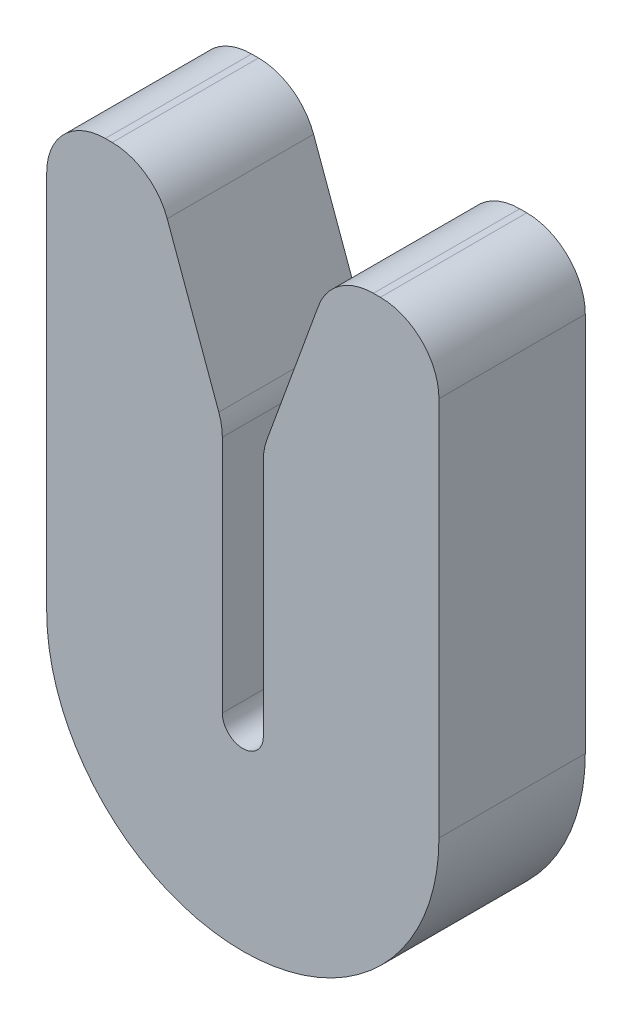
ISO-10303-21;
HEADER;
FILE_DESCRIPTION(('STEP AP214'),'2;1');
FILE_NAME('part.step','',(''),(''),'','','');
FILE_SCHEMA(('AUTOMOTIVE_DESIGN { 1 0 10303 214 1 1 1 1 }'));
ENDSEC;
DATA;
#1=APPLICATION_CONTEXT('core data for automotive mechanical design processes');
#2=APPLICATION_PROTOCOL_DEFINITION('international standard','automotive_design',2000,#1);
#3=PRODUCT_CONTEXT('',#1,'mechanical');
#4=PRODUCT('Part','Part','',(#3));
#5=PRODUCT_RELATED_PRODUCT_CATEGORY('part','',(#4));
#6=PRODUCT_DEFINITION_FORMATION('','',#4);
#7=PRODUCT_DEFINITION_CONTEXT('part definition',#1,'design');
#8=PRODUCT_DEFINITION('design','',#6,#7);
#9=PRODUCT_DEFINITION_SHAPE('','',#8);
#10=(LENGTH_UNIT() NAMED_UNIT(*) SI_UNIT(.MILLI.,.METRE.));
#11=(NAMED_UNIT(*) PLANE_ANGLE_UNIT() SI_UNIT($,.RADIAN.));
#12=(NAMED_UNIT(*) SI_UNIT($,.STERADIAN.) SOLID_ANGLE_UNIT());
#13=UNCERTAINTY_MEASURE_WITH_UNIT(LENGTH_MEASURE(1.E-05),#10,'distance_accuracy_value','');
#14=(GEOMETRIC_REPRESENTATION_CONTEXT(3) GLOBAL_UNCERTAINTY_ASSIGNED_CONTEXT((#13)) GLOBAL_UNIT_ASSIGNED_CONTEXT((#10,
#11,#12)) REPRESENTATION_CONTEXT('',''));
#15=CARTESIAN_POINT('',(0.,0.,0.));
#16=DIRECTION('',(0.,0.,1.));
#17=DIRECTION('',(1.,0.,0.));
#18=AXIS2_PLACEMENT_3D('',#15,#16,#17);
#19=CARTESIAN_POINT('',(0.7,8.51100736403509,5.));
#20=DIRECTION('',(0.939692620785908,-0.34202014332567,0.));
#21=DIRECTION('',(0.34202014332567,0.939692620785908,0.));
#22=AXIS2_PLACEMENT_3D('',#19,#20,#21);
#23=PLANE('',#22);
#24=DIRECTION('',(-0.34202014332567,-0.939692620785908,0.));
#25=VECTOR('',#24,1.);
#26=CARTESIAN_POINT('',(0.7,8.51100736403509,5.));
#27=LINE('',#26,#25);
#28=CARTESIAN_POINT('',(2.58283000471142,13.6840402866513,5.));
#29=VERTEX_POINT('',#28);
#30=CARTESIAN_POINT('',(0.820614758428184,8.8423936892695,5.));
#31=VERTEX_POINT('',#30);
#32=EDGE_CURVE('E165',#29,#31,#27,.T.);
#33=ORIENTED_EDGE('',*,*,#32,.F.);
#34=DIRECTION('',(0.,0.,-1.));
#35=VECTOR('',#34,1.);
#36=CARTESIAN_POINT('',(2.58283000471142,13.6840402866513,5.));
#37=LINE('',#36,#35);
#38=CARTESIAN_POINT('',(2.58283000471142,13.6840402866513,0.));
#39=VERTEX_POINT('',#38);
#40=EDGE_CURVE('E351',#29,#39,#37,.T.);
#41=ORIENTED_EDGE('',*,*,#40,.T.);
#42=DIRECTION('',(-0.34202014332567,-0.939692620785908,0.));
#43=VECTOR('',#42,1.);
#44=CARTESIAN_POINT('',(0.7,8.51100736403509,0.));
#45=LINE('',#44,#43);
#46=CARTESIAN_POINT('',(0.820614758428184,8.8423936892695,0.));
#47=VERTEX_POINT('',#46);
#48=EDGE_CURVE('E291',#39,#47,#45,.T.);
#49=ORIENTED_EDGE('',*,*,#48,.T.);
#50=DIRECTION('',(0.,0.,-1.));
#51=VECTOR('',#50,1.);
#52=CARTESIAN_POINT('',(0.820614758428184,8.8423936892695,5.));
#53=LINE('',#52,#51);
#54=EDGE_CURVE('E350',#47,#31,#53,.F.);
#55=ORIENTED_EDGE('',*,*,#54,.T.);
#56=EDGE_LOOP('',(#33,#41,#49,#55));
#57=FACE_BOUND('',#56,.T.);
#58=ADVANCED_FACE('F38',(#57),#23,.F.);
#59=CARTESIAN_POINT('',(0.7,0.,5.));
#60=DIRECTION('',(1.,0.,0.));
#61=DIRECTION('',(0.,0.,-1.));
#62=AXIS2_PLACEMENT_3D('',#59,#60,#61);
#63=PLANE('',#62);
#64=DIRECTION('',(0.,-1.,0.));
#65=VECTOR('',#64,1.);
#66=CARTESIAN_POINT('',(0.7,0.,5.));
#67=LINE('',#66,#65);
#68=CARTESIAN_POINT('',(0.7,8.15835340261816,5.));
#69=VERTEX_POINT('',#68);
#70=CARTESIAN_POINT('',(0.7,0.,5.));
#71=VERTEX_POINT('',#70);
#72=EDGE_CURVE('E150',#69,#71,#67,.T.);
#73=ORIENTED_EDGE('',*,*,#72,.F.);
#74=DIRECTION('',(0.,0.,-1.));
#75=VECTOR('',#74,1.);
#76=CARTESIAN_POINT('',(0.7,8.15835340261816,5.));
#77=LINE('',#76,#75);
#78=CARTESIAN_POINT('',(0.7,8.15835340261816,0.));
#79=VERTEX_POINT('',#78);
#80=EDGE_CURVE('E46',#69,#79,#77,.T.);
#81=ORIENTED_EDGE('',*,*,#80,.T.);
#82=DIRECTION('',(0.,-1.,0.));
#83=VECTOR('',#82,1.);
#84=CARTESIAN_POINT('',(0.7,0.,0.));
#85=LINE('',#84,#83);
#86=CARTESIAN_POINT('',(0.7,0.,0.));
#87=VERTEX_POINT('',#86);
#88=EDGE_CURVE('E171',#79,#87,#85,.T.);
#89=ORIENTED_EDGE('',*,*,#88,.T.);
#90=DIRECTION('',(0.,0.,-1.));
#91=VECTOR('',#90,1.);
#92=CARTESIAN_POINT('',(0.7,0.,5.));
#93=LINE('',#92,#91);
#94=EDGE_CURVE('E168',#71,#87,#93,.T.);
#95=ORIENTED_EDGE('',*,*,#94,.F.);
#96=EDGE_LOOP('',(#73,#81,#89,#95));
#97=FACE_BOUND('',#96,.T.);
#98=ADVANCED_FACE('F169',(#97),#63,.F.);
#99=CARTESIAN_POINT('',(0.,0.,5.));
#100=DIRECTION('',(0.,0.,-1.));
#101=DIRECTION('',(-1.,0.,0.));
#102=AXIS2_PLACEMENT_3D('',#99,#100,#101);
#103=CYLINDRICAL_SURFACE('',#102,0.7);
#104=CARTESIAN_POINT('',(0.,0.,0.));
#105=DIRECTION('',(0.,0.,-1.));
#106=DIRECTION('',(1.,0.,0.));
#107=AXIS2_PLACEMENT_3D('',#104,#105,#106);
#108=CIRCLE('',#107,0.7);
#109=CARTESIAN_POINT('',(-0.7,0.,0.));
#110=VERTEX_POINT('',#109);
#111=EDGE_CURVE('E295',#87,#110,#108,.T.);
#112=ORIENTED_EDGE('',*,*,#111,.T.);
#113=DIRECTION('',(0.,0.,-1.));
#114=VECTOR('',#113,1.);
#115=CARTESIAN_POINT('',(-0.7,0.,5.));
#116=LINE('',#115,#114);
#117=CARTESIAN_POINT('',(-0.7,0.,5.));
#118=VERTEX_POINT('',#117);
#119=EDGE_CURVE('E175',#118,#110,#116,.T.);
#120=ORIENTED_EDGE('',*,*,#119,.F.);
#121=CARTESIAN_POINT('',(0.,0.,5.));
#122=DIRECTION('',(0.,0.,-1.));
#123=DIRECTION('',(1.,0.,0.));
#124=AXIS2_PLACEMENT_3D('',#121,#122,#123);
#125=CIRCLE('',#124,0.7);
#126=EDGE_CURVE('E156',#71,#118,#125,.T.);
#127=ORIENTED_EDGE('',*,*,#126,.F.);
#128=ORIENTED_EDGE('',*,*,#94,.T.);
#129=EDGE_LOOP('',(#112,#120,#127,#128));
#130=FACE_BOUND('',#129,.T.);
#131=ADVANCED_FACE('F177',(#130),#103,.F.);
#132=CARTESIAN_POINT('',(-0.7,0.,5.));
#133=DIRECTION('',(-1.,0.,0.));
#134=DIRECTION('',(0.,0.,1.));
#135=AXIS2_PLACEMENT_3D('',#132,#133,#134);
#136=PLANE('',#135);
#137=DIRECTION('',(0.,1.,0.));
#138=VECTOR('',#137,1.);
#139=CARTESIAN_POINT('',(-0.7,0.,0.));
#140=LINE('',#139,#138);
#141=CARTESIAN_POINT('',(-0.7,8.15835340261816,0.));
#142=VERTEX_POINT('',#141);
#143=EDGE_CURVE('E297',#110,#142,#140,.T.);
#144=ORIENTED_EDGE('',*,*,#143,.T.);
#145=DIRECTION('',(0.,0.,-1.));
#146=VECTOR('',#145,1.);
#147=CARTESIAN_POINT('',(-0.7,8.15835340261816,5.));
#148=LINE('',#147,#146);
#149=CARTESIAN_POINT('',(-0.7,8.15835340261816,5.));
#150=VERTEX_POINT('',#149);
#151=EDGE_CURVE('E12',#142,#150,#148,.F.);
#152=ORIENTED_EDGE('',*,*,#151,.T.);
#153=DIRECTION('',(0.,1.,0.));
#154=VECTOR('',#153,1.);
#155=CARTESIAN_POINT('',(-0.7,0.,5.));
#156=LINE('',#155,#154);
#157=EDGE_CURVE('E181',#118,#150,#156,.T.);
#158=ORIENTED_EDGE('',*,*,#157,.F.);
#159=ORIENTED_EDGE('',*,*,#119,.T.);
#160=EDGE_LOOP('',(#144,#152,#158,#159));
#161=FACE_BOUND('',#160,.T.);
#162=ADVANCED_FACE('F391',(#161),#136,.F.);
#163=CARTESIAN_POINT('',(-3.06180016986381,15.,5.));
#164=DIRECTION('',(-0.939692620785908,-0.34202014332567,0.));
#165=DIRECTION('',(0.34202014332567,-0.939692620785908,0.));
#166=AXIS2_PLACEMENT_3D('',#163,#164,#165);
#167=PLANE('',#166);
#168=DIRECTION('',(-0.34202014332567,0.939692620785908,0.));
#169=VECTOR('',#168,1.);
#170=CARTESIAN_POINT('',(-3.06180016986381,15.,0.));
#171=LINE('',#170,#169);
#172=CARTESIAN_POINT('',(-0.820614758428184,8.8423936892695,0.));
#173=VERTEX_POINT('',#172);
#174=CARTESIAN_POINT('',(-2.58283000471142,13.6840402866513,0.));
#175=VERTEX_POINT('',#174);
#176=EDGE_CURVE('E300',#173,#175,#171,.T.);
#177=ORIENTED_EDGE('',*,*,#176,.T.);
#178=DIRECTION('',(0.,0.,-1.));
#179=VECTOR('',#178,1.);
#180=CARTESIAN_POINT('',(-2.58283000471142,13.6840402866513,5.));
#181=LINE('',#180,#179);
#182=CARTESIAN_POINT('',(-2.58283000471142,13.6840402866513,5.));
#183=VERTEX_POINT('',#182);
#184=EDGE_CURVE('E356',#175,#183,#181,.F.);
#185=ORIENTED_EDGE('',*,*,#184,.T.);
#186=DIRECTION('',(-0.34202014332567,0.939692620785908,0.));
#187=VECTOR('',#186,1.);
#188=CARTESIAN_POINT('',(-3.06180016986381,15.,5.));
#189=LINE('',#188,#187);
#190=CARTESIAN_POINT('',(-0.820614758428184,8.8423936892695,5.));
#191=VERTEX_POINT('',#190);
#192=EDGE_CURVE('E184',#191,#183,#189,.T.);
#193=ORIENTED_EDGE('',*,*,#192,.F.);
#194=DIRECTION('',(0.,0.,-1.));
#195=VECTOR('',#194,1.);
#196=CARTESIAN_POINT('',(-0.820614758428184,8.8423936892695,5.));
#197=LINE('',#196,#195);
#198=EDGE_CURVE('E358',#191,#173,#197,.T.);
#199=ORIENTED_EDGE('',*,*,#198,.T.);
#200=EDGE_LOOP('',(#177,#185,#193,#199));
#201=FACE_BOUND('',#200,.T.);
#202=ADVANCED_FACE('F397',(#201),#167,.F.);
#203=CARTESIAN_POINT('',(-6.7,15.,5.));
#204=DIRECTION('',(0.,-1.,0.));
#205=DIRECTION('',(0.,0.,-1.));
#206=AXIS2_PLACEMENT_3D('',#203,#204,#205);
#207=PLANE('',#206);
#208=DIRECTION('',(-1.,0.,0.));
#209=VECTOR('',#208,1.);
#210=CARTESIAN_POINT('',(-6.7,15.,0.));
#211=LINE('',#210,#209);
#212=CARTESIAN_POINT('',(-4.46221524628323,15.,0.));
#213=VERTEX_POINT('',#212);
#214=CARTESIAN_POINT('',(-4.7,15.,0.));
#215=VERTEX_POINT('',#214);
#216=EDGE_CURVE('E303',#213,#215,#211,.T.);
#217=ORIENTED_EDGE('',*,*,#216,.T.);
#218=DIRECTION('',(0.,0.,-1.));
#219=VECTOR('',#218,1.);
#220=CARTESIAN_POINT('',(-4.7,15.,5.));
#221=LINE('',#220,#219);
#222=CARTESIAN_POINT('',(-4.7,15.,5.));
#223=VERTEX_POINT('',#222);
#224=EDGE_CURVE('E61',#215,#223,#221,.F.);
#225=ORIENTED_EDGE('',*,*,#224,.T.);
#226=DIRECTION('',(-1.,0.,0.));
#227=VECTOR('',#226,1.);
#228=CARTESIAN_POINT('',(-6.7,15.,5.));
#229=LINE('',#228,#227);
#230=CARTESIAN_POINT('',(-4.46221524628323,15.,5.));
#231=VERTEX_POINT('',#230);
#232=EDGE_CURVE('E365',#231,#223,#229,.T.);
#233=ORIENTED_EDGE('',*,*,#232,.F.);
#234=DIRECTION('',(0.,0.,-1.));
#235=VECTOR('',#234,1.);
#236=CARTESIAN_POINT('',(-4.46221524628323,15.,5.));
#237=LINE('',#236,#235);
#238=EDGE_CURVE('E277',#231,#213,#237,.T.);
#239=ORIENTED_EDGE('',*,*,#238,.T.);
#240=EDGE_LOOP('',(#217,#225,#233,#239));
#241=FACE_BOUND('',#240,.T.);
#242=ADVANCED_FACE('F364',(#241),#207,.F.);
#243=CARTESIAN_POINT('',(-6.7,15.,5.));
#244=DIRECTION('',(1.,0.,0.));
#245=DIRECTION('',(0.,1.,0.));
#246=AXIS2_PLACEMENT_3D('',#243,#244,#245);
#247=PLANE('',#246);
#248=DIRECTION('',(0.,-1.,0.));
#249=VECTOR('',#248,1.);
#250=CARTESIAN_POINT('',(-6.7,15.,5.));
#251=LINE('',#250,#249);
#252=CARTESIAN_POINT('',(-6.7,13.,5.));
#253=VERTEX_POINT('',#252);
#254=CARTESIAN_POINT('',(-6.7,0.,5.));
#255=VERTEX_POINT('',#254);
#256=EDGE_CURVE('E371',#253,#255,#251,.T.);
#257=ORIENTED_EDGE('',*,*,#256,.F.);
#258=DIRECTION('',(0.,0.,-1.));
#259=VECTOR('',#258,1.);
#260=CARTESIAN_POINT('',(-6.7,13.,5.));
#261=LINE('',#260,#259);
#262=CARTESIAN_POINT('',(-6.7,13.,0.));
#263=VERTEX_POINT('',#262);
#264=EDGE_CURVE('E273',#253,#263,#261,.T.);
#265=ORIENTED_EDGE('',*,*,#264,.T.);
#266=DIRECTION('',(0.,-1.,0.));
#267=VECTOR('',#266,1.);
#268=CARTESIAN_POINT('',(-6.7,15.,0.));
#269=LINE('',#268,#267);
#270=CARTESIAN_POINT('',(-6.7,0.,0.));
#271=VERTEX_POINT('',#270);
#272=EDGE_CURVE('E305',#263,#271,#269,.T.);
#273=ORIENTED_EDGE('',*,*,#272,.T.);
#274=DIRECTION('',(0.,0.,-1.));
#275=VECTOR('',#274,1.);
#276=CARTESIAN_POINT('',(-6.7,0.,5.));
#277=LINE('',#276,#275);
#278=EDGE_CURVE('E235',#255,#271,#277,.T.);
#279=ORIENTED_EDGE('',*,*,#278,.F.);
#280=EDGE_LOOP('',(#257,#265,#273,#279));
#281=FACE_BOUND('',#280,.T.);
#282=ADVANCED_FACE('F370',(#281),#247,.F.);
#283=CARTESIAN_POINT('',(0.,0.,5.));
#284=DIRECTION('',(0.,0.,-1.));
#285=DIRECTION('',(-1.,0.,0.));
#286=AXIS2_PLACEMENT_3D('',#283,#284,#285);
#287=CYLINDRICAL_SURFACE('',#286,6.7);
#288=CARTESIAN_POINT('',(0.,0.,0.));
#289=DIRECTION('',(0.,0.,1.));
#290=DIRECTION('',(1.,0.,0.));
#291=AXIS2_PLACEMENT_3D('',#288,#289,#290);
#292=CIRCLE('',#291,6.7);
#293=CARTESIAN_POINT('',(6.7,0.,0.));
#294=VERTEX_POINT('',#293);
#295=EDGE_CURVE('E228',#271,#294,#292,.T.);
#296=ORIENTED_EDGE('',*,*,#295,.T.);
#297=DIRECTION('',(0.,0.,-1.));
#298=VECTOR('',#297,1.);
#299=CARTESIAN_POINT('',(6.7,0.,5.));
#300=LINE('',#299,#298);
#301=CARTESIAN_POINT('',(6.7,0.,5.));
#302=VERTEX_POINT('',#301);
#303=EDGE_CURVE('E232',#302,#294,#300,.T.);
#304=ORIENTED_EDGE('',*,*,#303,.F.);
#305=CARTESIAN_POINT('',(0.,0.,5.));
#306=DIRECTION('',(0.,0.,1.));
#307=DIRECTION('',(1.,0.,0.));
#308=AXIS2_PLACEMENT_3D('',#305,#306,#307);
#309=CIRCLE('',#308,6.7);
#310=EDGE_CURVE('E266',#255,#302,#309,.T.);
#311=ORIENTED_EDGE('',*,*,#310,.F.);
#312=ORIENTED_EDGE('',*,*,#278,.T.);
#313=EDGE_LOOP('',(#296,#304,#311,#312));
#314=FACE_BOUND('',#313,.T.);
#315=ADVANCED_FACE('F308',(#314),#287,.T.);
#316=CARTESIAN_POINT('',(6.7,15.,5.));
#317=DIRECTION('',(-1.,0.,0.));
#318=DIRECTION('',(0.,-1.,0.));
#319=AXIS2_PLACEMENT_3D('',#316,#317,#318);
#320=PLANE('',#319);
#321=DIRECTION('',(0.,1.,0.));
#322=VECTOR('',#321,1.);
#323=CARTESIAN_POINT('',(6.7,15.,0.));
#324=LINE('',#323,#322);
#325=CARTESIAN_POINT('',(6.7,13.,0.));
#326=VERTEX_POINT('',#325);
#327=EDGE_CURVE('E221',#294,#326,#324,.T.);
#328=ORIENTED_EDGE('',*,*,#327,.T.);
#329=DIRECTION('',(0.,0.,-1.));
#330=VECTOR('',#329,1.);
#331=CARTESIAN_POINT('',(6.7,13.,5.));
#332=LINE('',#331,#330);
#333=CARTESIAN_POINT('',(6.7,13.,5.));
#334=VERTEX_POINT('',#333);
#335=EDGE_CURVE('E204',#326,#334,#332,.F.);
#336=ORIENTED_EDGE('',*,*,#335,.T.);
#337=DIRECTION('',(0.,1.,0.));
#338=VECTOR('',#337,1.);
#339=CARTESIAN_POINT('',(6.7,15.,5.));
#340=LINE('',#339,#338);
#341=EDGE_CURVE('E259',#302,#334,#340,.T.);
#342=ORIENTED_EDGE('',*,*,#341,.F.);
#343=ORIENTED_EDGE('',*,*,#303,.T.);
#344=EDGE_LOOP('',(#328,#336,#342,#343));
#345=FACE_BOUND('',#344,.T.);
#346=ADVANCED_FACE('F258',(#345),#320,.F.);
#347=CARTESIAN_POINT('',(3.06180016986382,15.,5.));
#348=DIRECTION('',(0.,-1.,0.));
#349=DIRECTION('',(0.,0.,-1.));
#350=AXIS2_PLACEMENT_3D('',#347,#348,#349);
#351=PLANE('',#350);
#352=DIRECTION('',(-1.,0.,0.));
#353=VECTOR('',#352,1.);
#354=CARTESIAN_POINT('',(3.06180016986382,15.,5.));
#355=LINE('',#354,#353);
#356=CARTESIAN_POINT('',(4.7,15.,5.));
#357=VERTEX_POINT('',#356);
#358=CARTESIAN_POINT('',(4.46221524628323,15.,5.));
#359=VERTEX_POINT('',#358);
#360=EDGE_CURVE('E236',#357,#359,#355,.T.);
#361=ORIENTED_EDGE('',*,*,#360,.F.);
#362=DIRECTION('',(0.,0.,-1.));
#363=VECTOR('',#362,1.);
#364=CARTESIAN_POINT('',(4.7,15.,5.));
#365=LINE('',#364,#363);
#366=CARTESIAN_POINT('',(4.7,15.,0.));
#367=VERTEX_POINT('',#366);
#368=EDGE_CURVE('E241',#357,#367,#365,.T.);
#369=ORIENTED_EDGE('',*,*,#368,.T.);
#370=DIRECTION('',(-1.,0.,0.));
#371=VECTOR('',#370,1.);
#372=CARTESIAN_POINT('',(3.06180016986382,15.,0.));
#373=LINE('',#372,#371);
#374=CARTESIAN_POINT('',(4.46221524628323,15.,0.));
#375=VERTEX_POINT('',#374);
#376=EDGE_CURVE('E217',#367,#375,#373,.T.);
#377=ORIENTED_EDGE('',*,*,#376,.T.);
#378=DIRECTION('',(0.,0.,-1.));
#379=VECTOR('',#378,1.);
#380=CARTESIAN_POINT('',(4.46221524628323,15.,5.));
#381=LINE('',#380,#379);
#382=EDGE_CURVE('E174',#375,#359,#381,.F.);
#383=ORIENTED_EDGE('',*,*,#382,.T.);
#384=EDGE_LOOP('',(#361,#369,#377,#383));
#385=FACE_BOUND('',#384,.T.);
#386=ADVANCED_FACE('F320',(#385),#351,.F.);
#387=CARTESIAN_POINT('',(0.,0.,5.));
#388=DIRECTION('',(0.,0.,1.));
#389=DIRECTION('',(1.,0.,0.));
#390=AXIS2_PLACEMENT_3D('',#387,#388,#389);
#391=PLANE('',#390);
#392=ORIENTED_EDGE('',*,*,#341,.T.);
#393=CARTESIAN_POINT('',(4.7,13.,5.));
#394=DIRECTION('',(0.,0.,1.));
#395=DIRECTION('',(1.,0.,0.));
#396=AXIS2_PLACEMENT_3D('',#393,#394,#395);
#397=CIRCLE('',#396,2.);
#398=EDGE_CURVE('E263',#334,#357,#397,.T.);
#399=ORIENTED_EDGE('',*,*,#398,.T.);
#400=ORIENTED_EDGE('',*,*,#360,.T.);
#401=CARTESIAN_POINT('',(4.46221524628323,13.,5.));
#402=DIRECTION('',(0.,0.,1.));
#403=DIRECTION('',(1.,0.,0.));
#404=AXIS2_PLACEMENT_3D('',#401,#402,#403);
#405=CIRCLE('',#404,2.);
#406=EDGE_CURVE('E209',#359,#29,#405,.T.);
#407=ORIENTED_EDGE('',*,*,#406,.T.);
#408=ORIENTED_EDGE('',*,*,#32,.T.);
#409=CARTESIAN_POINT('',(2.7,8.15835340261816,5.));
#410=DIRECTION('',(0.,0.,1.));
#411=DIRECTION('',(1.,0.,0.));
#412=AXIS2_PLACEMENT_3D('',#409,#410,#411);
#413=CIRCLE('',#412,2.);
#414=EDGE_CURVE('E160',#31,#69,#413,.T.);
#415=ORIENTED_EDGE('',*,*,#414,.T.);
#416=ORIENTED_EDGE('',*,*,#72,.T.);
#417=ORIENTED_EDGE('',*,*,#126,.T.);
#418=ORIENTED_EDGE('',*,*,#157,.T.);
#419=CARTESIAN_POINT('',(-2.7,8.15835340261816,5.));
#420=DIRECTION('',(0.,0.,1.));
#421=DIRECTION('',(1.,0.,0.));
#422=AXIS2_PLACEMENT_3D('',#419,#420,#421);
#423=CIRCLE('',#422,2.);
#424=EDGE_CURVE('E199',#150,#191,#423,.T.);
#425=ORIENTED_EDGE('',*,*,#424,.T.);
#426=ORIENTED_EDGE('',*,*,#192,.T.);
#427=CARTESIAN_POINT('',(-4.46221524628323,13.,5.));
#428=DIRECTION('',(0.,0.,1.));
#429=DIRECTION('',(1.,0.,0.));
#430=AXIS2_PLACEMENT_3D('',#427,#428,#429);
#431=CIRCLE('',#430,2.);
#432=EDGE_CURVE('E280',#183,#231,#431,.T.);
#433=ORIENTED_EDGE('',*,*,#432,.T.);
#434=ORIENTED_EDGE('',*,*,#232,.T.);
#435=CARTESIAN_POINT('',(-4.7,13.,5.));
#436=DIRECTION('',(0.,0.,1.));
#437=DIRECTION('',(1.,0.,0.));
#438=AXIS2_PLACEMENT_3D('',#435,#436,#437);
#439=CIRCLE('',#438,2.);
#440=EDGE_CURVE('E53',#223,#253,#439,.T.);
#441=ORIENTED_EDGE('',*,*,#440,.T.);
#442=ORIENTED_EDGE('',*,*,#256,.T.);
#443=ORIENTED_EDGE('',*,*,#310,.T.);
#444=EDGE_LOOP('',(#392,#399,#400,#407,#408,#415,#416,#417,#418,#425,#426,#433,#434,#441,#442,#443));
#445=FACE_BOUND('',#444,.T.);
#446=ADVANCED_FACE('F153',(#445),#391,.T.);
#447=CARTESIAN_POINT('',(0.,0.,0.));
#448=DIRECTION('',(0.,0.,1.));
#449=DIRECTION('',(1.,0.,0.));
#450=AXIS2_PLACEMENT_3D('',#447,#448,#449);
#451=PLANE('',#450);
#452=ORIENTED_EDGE('',*,*,#376,.F.);
#453=CARTESIAN_POINT('',(4.7,13.,0.));
#454=DIRECTION('',(0.,0.,1.));
#455=DIRECTION('',(1.,0.,0.));
#456=AXIS2_PLACEMENT_3D('',#453,#454,#455);
#457=CIRCLE('',#456,2.);
#458=EDGE_CURVE('E252',#367,#326,#457,.F.);
#459=ORIENTED_EDGE('',*,*,#458,.T.);
#460=ORIENTED_EDGE('',*,*,#327,.F.);
#461=ORIENTED_EDGE('',*,*,#295,.F.);
#462=ORIENTED_EDGE('',*,*,#272,.F.);
#463=CARTESIAN_POINT('',(-4.7,13.,0.));
#464=DIRECTION('',(0.,0.,1.));
#465=DIRECTION('',(1.,0.,0.));
#466=AXIS2_PLACEMENT_3D('',#463,#464,#465);
#467=CIRCLE('',#466,2.);
#468=EDGE_CURVE('E251',#263,#215,#467,.F.);
#469=ORIENTED_EDGE('',*,*,#468,.T.);
#470=ORIENTED_EDGE('',*,*,#216,.F.);
#471=CARTESIAN_POINT('',(-4.46221524628323,13.,0.));
#472=DIRECTION('',(0.,0.,1.));
#473=DIRECTION('',(1.,0.,0.));
#474=AXIS2_PLACEMENT_3D('',#471,#472,#473);
#475=CIRCLE('',#474,2.);
#476=EDGE_CURVE('E249',#213,#175,#475,.F.);
#477=ORIENTED_EDGE('',*,*,#476,.T.);
#478=ORIENTED_EDGE('',*,*,#176,.F.);
#479=CARTESIAN_POINT('',(-2.7,8.15835340261816,0.));
#480=DIRECTION('',(0.,0.,1.));
#481=DIRECTION('',(1.,0.,0.));
#482=AXIS2_PLACEMENT_3D('',#479,#480,#481);
#483=CIRCLE('',#482,2.);
#484=EDGE_CURVE('E243',#173,#142,#483,.F.);
#485=ORIENTED_EDGE('',*,*,#484,.T.);
#486=ORIENTED_EDGE('',*,*,#143,.F.);
#487=ORIENTED_EDGE('',*,*,#111,.F.);
#488=ORIENTED_EDGE('',*,*,#88,.F.);
#489=CARTESIAN_POINT('',(2.7,8.15835340261816,0.));
#490=DIRECTION('',(0.,0.,1.));
#491=DIRECTION('',(1.,0.,0.));
#492=AXIS2_PLACEMENT_3D('',#489,#490,#491);
#493=CIRCLE('',#492,2.);
#494=EDGE_CURVE('E245',#79,#47,#493,.F.);
#495=ORIENTED_EDGE('',*,*,#494,.T.);
#496=ORIENTED_EDGE('',*,*,#48,.F.);
#497=CARTESIAN_POINT('',(4.46221524628323,13.,0.));
#498=DIRECTION('',(0.,0.,1.));
#499=DIRECTION('',(1.,0.,0.));
#500=AXIS2_PLACEMENT_3D('',#497,#498,#499);
#501=CIRCLE('',#500,2.);
#502=EDGE_CURVE('E247',#39,#375,#501,.F.);
#503=ORIENTED_EDGE('',*,*,#502,.T.);
#504=EDGE_LOOP('',(#452,#459,#460,#461,#462,#469,#470,#477,#478,#485,#486,#487,#488,#495,#496,#503));
#505=FACE_BOUND('',#504,.T.);
#506=ADVANCED_FACE('F311',(#505),#451,.F.);
#507=CARTESIAN_POINT('',(4.7,13.,5.));
#508=DIRECTION('',(0.,0.,-1.));
#509=DIRECTION('',(-1.,0.,0.));
#510=AXIS2_PLACEMENT_3D('',#507,#508,#509);
#511=CYLINDRICAL_SURFACE('',#510,2.);
#512=ORIENTED_EDGE('',*,*,#398,.F.);
#513=ORIENTED_EDGE('',*,*,#335,.F.);
#514=ORIENTED_EDGE('',*,*,#458,.F.);
#515=ORIENTED_EDGE('',*,*,#368,.F.);
#516=EDGE_LOOP('',(#512,#513,#514,#515));
#517=FACE_BOUND('',#516,.T.);
#518=ADVANCED_FACE('F271',(#517),#511,.T.);
#519=CARTESIAN_POINT('',(-4.7,13.,5.));
#520=DIRECTION('',(0.,0.,-1.));
#521=DIRECTION('',(-1.,0.,0.));
#522=AXIS2_PLACEMENT_3D('',#519,#520,#521);
#523=CYLINDRICAL_SURFACE('',#522,2.);
#524=ORIENTED_EDGE('',*,*,#440,.F.);
#525=ORIENTED_EDGE('',*,*,#224,.F.);
#526=ORIENTED_EDGE('',*,*,#468,.F.);
#527=ORIENTED_EDGE('',*,*,#264,.F.);
#528=EDGE_LOOP('',(#524,#525,#526,#527));
#529=FACE_BOUND('',#528,.T.);
#530=ADVANCED_FACE('F318',(#529),#523,.T.);
#531=CARTESIAN_POINT('',(-4.46221524628323,13.,5.));
#532=DIRECTION('',(0.,0.,-1.));
#533=DIRECTION('',(-1.,0.,0.));
#534=AXIS2_PLACEMENT_3D('',#531,#532,#533);
#535=CYLINDRICAL_SURFACE('',#534,2.);
#536=ORIENTED_EDGE('',*,*,#432,.F.);
#537=ORIENTED_EDGE('',*,*,#184,.F.);
#538=ORIENTED_EDGE('',*,*,#476,.F.);
#539=ORIENTED_EDGE('',*,*,#238,.F.);
#540=EDGE_LOOP('',(#536,#537,#538,#539));
#541=FACE_BOUND('',#540,.T.);
#542=ADVANCED_FACE('F334',(#541),#535,.T.);
#543=CARTESIAN_POINT('',(4.46221524628323,13.,5.));
#544=DIRECTION('',(0.,0.,-1.));
#545=DIRECTION('',(-1.,0.,0.));
#546=AXIS2_PLACEMENT_3D('',#543,#544,#545);
#547=CYLINDRICAL_SURFACE('',#546,2.);
#548=ORIENTED_EDGE('',*,*,#406,.F.);
#549=ORIENTED_EDGE('',*,*,#382,.F.);
#550=ORIENTED_EDGE('',*,*,#502,.F.);
#551=ORIENTED_EDGE('',*,*,#40,.F.);
#552=EDGE_LOOP('',(#548,#549,#550,#551));
#553=FACE_BOUND('',#552,.T.);
#554=ADVANCED_FACE('F338',(#553),#547,.T.);
#555=CARTESIAN_POINT('',(2.7,8.15835340261816,5.));
#556=DIRECTION('',(0.,0.,-1.));
#557=DIRECTION('',(-1.,0.,0.));
#558=AXIS2_PLACEMENT_3D('',#555,#556,#557);
#559=CYLINDRICAL_SURFACE('',#558,2.);
#560=ORIENTED_EDGE('',*,*,#414,.F.);
#561=ORIENTED_EDGE('',*,*,#54,.F.);
#562=ORIENTED_EDGE('',*,*,#494,.F.);
#563=ORIENTED_EDGE('',*,*,#80,.F.);
#564=EDGE_LOOP('',(#560,#561,#562,#563));
#565=FACE_BOUND('',#564,.T.);
#566=ADVANCED_FACE('F341',(#565),#559,.T.);
#567=CARTESIAN_POINT('',(-2.7,8.15835340261816,5.));
#568=DIRECTION('',(0.,0.,-1.));
#569=DIRECTION('',(-1.,0.,0.));
#570=AXIS2_PLACEMENT_3D('',#567,#568,#569);
#571=CYLINDRICAL_SURFACE('',#570,2.);
#572=ORIENTED_EDGE('',*,*,#424,.F.);
#573=ORIENTED_EDGE('',*,*,#151,.F.);
#574=ORIENTED_EDGE('',*,*,#484,.F.);
#575=ORIENTED_EDGE('',*,*,#198,.F.);
#576=EDGE_LOOP('',(#572,#573,#574,#575));
#577=FACE_BOUND('',#576,.T.);
#578=ADVANCED_FACE('F40',(#577),#571,.T.);
#579=CLOSED_SHELL('',(#58,#98,#131,#162,#202,#242,#282,#315,#346,#386,#446,#506,#518,#530,#542,
#554,#566,#578));
#580=MANIFOLD_SOLID_BREP('B2',#579);
#581=ADVANCED_BREP_SHAPE_REPRESENTATION('',(#18,#580),#14);
#582=SHAPE_DEFINITION_REPRESENTATION(#9,#581);
ENDSEC;
END-ISO-10303-21;
